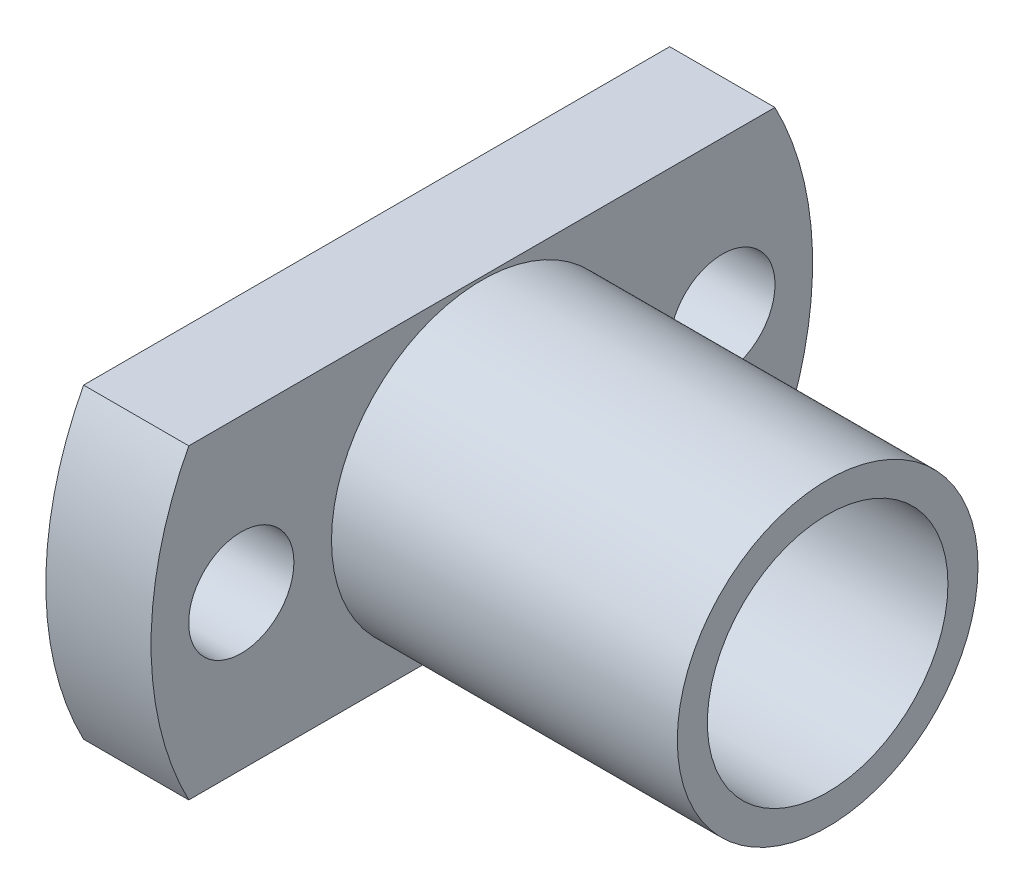
ISO-10303-21;
HEADER;
FILE_DESCRIPTION(('STEP AP214'),'2;1');
FILE_NAME('part.step','',(''),(''),'','','');
FILE_SCHEMA(('AUTOMOTIVE_DESIGN { 1 0 10303 214 1 1 1 1 }'));
ENDSEC;
DATA;
#1=APPLICATION_CONTEXT('core data for automotive mechanical design processes');
#2=APPLICATION_PROTOCOL_DEFINITION('international standard','automotive_design',2000,#1);
#3=PRODUCT_CONTEXT('',#1,'mechanical');
#4=PRODUCT('Part','Part','',(#3));
#5=PRODUCT_RELATED_PRODUCT_CATEGORY('part','',(#4));
#6=PRODUCT_DEFINITION_FORMATION('','',#4);
#7=PRODUCT_DEFINITION_CONTEXT('part definition',#1,'design');
#8=PRODUCT_DEFINITION('design','',#6,#7);
#9=PRODUCT_DEFINITION_SHAPE('','',#8);
#10=(LENGTH_UNIT() NAMED_UNIT(*) SI_UNIT(.MILLI.,.METRE.));
#11=(NAMED_UNIT(*) PLANE_ANGLE_UNIT() SI_UNIT($,.RADIAN.));
#12=(NAMED_UNIT(*) SI_UNIT($,.STERADIAN.) SOLID_ANGLE_UNIT());
#13=UNCERTAINTY_MEASURE_WITH_UNIT(LENGTH_MEASURE(1.E-05),#10,'distance_accuracy_value','');
#14=(GEOMETRIC_REPRESENTATION_CONTEXT(3) GLOBAL_UNCERTAINTY_ASSIGNED_CONTEXT((#13)) GLOBAL_UNIT_ASSIGNED_CONTEXT((#10,
#11,#12)) REPRESENTATION_CONTEXT('',''));
#15=CARTESIAN_POINT('',(0.,0.,0.));
#16=DIRECTION('',(0.,0.,1.));
#17=DIRECTION('',(1.,0.,0.));
#18=AXIS2_PLACEMENT_3D('',#15,#16,#17);
#19=CARTESIAN_POINT('',(5.,0.,0.));
#20=DIRECTION('',(1.,0.,0.));
#21=DIRECTION('',(0.,0.,-1.));
#22=AXIS2_PLACEMENT_3D('',#19,#20,#21);
#23=PLANE('',#22);
#24=CARTESIAN_POINT('',(5.,0.,-8.));
#25=DIRECTION('',(1.,0.,0.));
#26=DIRECTION('',(0.,0.,-1.));
#27=AXIS2_PLACEMENT_3D('',#24,#25,#26);
#28=CIRCLE('',#27,1.75);
#29=CARTESIAN_POINT('',(5.,0.,-9.75));
#30=VERTEX_POINT('',#29);
#31=EDGE_CURVE('E121',#30,#30,#28,.T.);
#32=ORIENTED_EDGE('',*,*,#31,.F.);
#33=EDGE_LOOP('',(#32));
#34=FACE_BOUND('',#33,.T.);
#35=CARTESIAN_POINT('',(5.,0.,0.));
#36=DIRECTION('',(1.,0.,0.));
#37=DIRECTION('',(0.,0.,-1.));
#38=AXIS2_PLACEMENT_3D('',#35,#36,#37);
#39=CIRCLE('',#38,11.);
#40=CARTESIAN_POINT('',(5.,5.1,9.74628134213249));
#41=VERTEX_POINT('',#40);
#42=CARTESIAN_POINT('',(5.,-5.1,9.74628134213249));
#43=VERTEX_POINT('',#42);
#44=EDGE_CURVE('E89',#41,#43,#39,.T.);
#45=ORIENTED_EDGE('',*,*,#44,.T.);
#46=DIRECTION('',(0.,0.,-1.));
#47=VECTOR('',#46,1.);
#48=CARTESIAN_POINT('',(5.,-5.1,9.74628134213249));
#49=LINE('',#48,#47);
#50=CARTESIAN_POINT('',(5.,-5.1,-9.74628134213249));
#51=VERTEX_POINT('',#50);
#52=EDGE_CURVE('E84',#43,#51,#49,.T.);
#53=ORIENTED_EDGE('',*,*,#52,.T.);
#54=CARTESIAN_POINT('',(5.,0.,0.));
#55=DIRECTION('',(1.,0.,0.));
#56=DIRECTION('',(0.,0.,-1.));
#57=AXIS2_PLACEMENT_3D('',#54,#55,#56);
#58=CIRCLE('',#57,11.);
#59=CARTESIAN_POINT('',(5.,5.1,-9.74628134213249));
#60=VERTEX_POINT('',#59);
#61=EDGE_CURVE('E87',#51,#60,#58,.T.);
#62=ORIENTED_EDGE('',*,*,#61,.T.);
#63=DIRECTION('',(0.,0.,1.));
#64=VECTOR('',#63,1.);
#65=CARTESIAN_POINT('',(5.,5.1,9.74628134213249));
#66=LINE('',#65,#64);
#67=EDGE_CURVE('E54',#60,#41,#66,.T.);
#68=ORIENTED_EDGE('',*,*,#67,.T.);
#69=EDGE_LOOP('',(#45,#53,#62,#68));
#70=FACE_BOUND('',#69,.T.);
#71=CARTESIAN_POINT('',(5.,0.,8.));
#72=DIRECTION('',(1.,0.,0.));
#73=DIRECTION('',(0.,0.,-1.));
#74=AXIS2_PLACEMENT_3D('',#71,#72,#73);
#75=CIRCLE('',#74,1.75);
#76=CARTESIAN_POINT('',(5.,0.,6.25));
#77=VERTEX_POINT('',#76);
#78=EDGE_CURVE('E105',#77,#77,#75,.T.);
#79=ORIENTED_EDGE('',*,*,#78,.F.);
#80=EDGE_LOOP('',(#79));
#81=FACE_BOUND('',#80,.T.);
#82=CARTESIAN_POINT('',(5.,0.,0.));
#83=DIRECTION('',(1.,0.,0.));
#84=DIRECTION('',(0.,0.,-1.));
#85=AXIS2_PLACEMENT_3D('',#82,#83,#84);
#86=CIRCLE('',#85,5.);
#87=CARTESIAN_POINT('',(5.,0.,-5.));
#88=VERTEX_POINT('',#87);
#89=EDGE_CURVE('E130',#88,#88,#86,.T.);
#90=ORIENTED_EDGE('',*,*,#89,.F.);
#91=EDGE_LOOP('',(#90));
#92=FACE_BOUND('',#91,.T.);
#93=ADVANCED_FACE('F36',(#34,#70,#81,#92),#23,.T.);
#94=CARTESIAN_POINT('',(1.5,0.,0.));
#95=DIRECTION('',(-1.,0.,0.));
#96=DIRECTION('',(0.,0.,1.));
#97=AXIS2_PLACEMENT_3D('',#94,#95,#96);
#98=CYLINDRICAL_SURFACE('',#97,4.);
#99=CARTESIAN_POINT('',(1.5,0.,0.));
#100=DIRECTION('',(1.,0.,0.));
#101=DIRECTION('',(0.,0.,-1.));
#102=AXIS2_PLACEMENT_3D('',#99,#100,#101);
#103=CIRCLE('',#102,4.);
#104=CARTESIAN_POINT('',(1.5,0.,-4.));
#105=VERTEX_POINT('',#104);
#106=EDGE_CURVE('E40',#105,#105,#103,.T.);
#107=ORIENTED_EDGE('',*,*,#106,.F.);
#108=EDGE_LOOP('',(#107));
#109=FACE_BOUND('',#108,.T.);
#110=CARTESIAN_POINT('',(16.5,0.,0.));
#111=DIRECTION('',(1.,0.,0.));
#112=DIRECTION('',(0.,0.,-1.));
#113=AXIS2_PLACEMENT_3D('',#110,#111,#112);
#114=CIRCLE('',#113,4.);
#115=CARTESIAN_POINT('',(16.5,0.,-4.));
#116=VERTEX_POINT('',#115);
#117=EDGE_CURVE('E133',#116,#116,#114,.T.);
#118=ORIENTED_EDGE('',*,*,#117,.T.);
#119=EDGE_LOOP('',(#118));
#120=FACE_BOUND('',#119,.T.);
#121=ADVANCED_FACE('F38',(#109,#120),#98,.F.);
#122=CARTESIAN_POINT('',(1.5,0.,0.));
#123=DIRECTION('',(1.,0.,0.));
#124=DIRECTION('',(0.,0.,-1.));
#125=AXIS2_PLACEMENT_3D('',#122,#123,#124);
#126=PLANE('',#125);
#127=CARTESIAN_POINT('',(1.5,0.,0.));
#128=DIRECTION('',(1.,0.,0.));
#129=DIRECTION('',(0.,0.,-1.));
#130=AXIS2_PLACEMENT_3D('',#127,#128,#129);
#131=CIRCLE('',#130,11.);
#132=CARTESIAN_POINT('',(1.5,5.1,9.74628134213249));
#133=VERTEX_POINT('',#132);
#134=CARTESIAN_POINT('',(1.5,-5.1,9.74628134213249));
#135=VERTEX_POINT('',#134);
#136=EDGE_CURVE('E102',#133,#135,#131,.T.);
#137=ORIENTED_EDGE('',*,*,#136,.F.);
#138=DIRECTION('',(0.,0.,1.));
#139=VECTOR('',#138,1.);
#140=CARTESIAN_POINT('',(1.5,5.1,9.74628134213249));
#141=LINE('',#140,#139);
#142=CARTESIAN_POINT('',(1.5,5.1,-9.74628134213249));
#143=VERTEX_POINT('',#142);
#144=EDGE_CURVE('E77',#143,#133,#141,.T.);
#145=ORIENTED_EDGE('',*,*,#144,.F.);
#146=CARTESIAN_POINT('',(1.5,0.,0.));
#147=DIRECTION('',(1.,0.,0.));
#148=DIRECTION('',(0.,0.,-1.));
#149=AXIS2_PLACEMENT_3D('',#146,#147,#148);
#150=CIRCLE('',#149,11.);
#151=CARTESIAN_POINT('',(1.5,-5.1,-9.74628134213249));
#152=VERTEX_POINT('',#151);
#153=EDGE_CURVE('E71',#152,#143,#150,.T.);
#154=ORIENTED_EDGE('',*,*,#153,.F.);
#155=DIRECTION('',(0.,0.,-1.));
#156=VECTOR('',#155,1.);
#157=CARTESIAN_POINT('',(1.5,-5.1,9.74628134213249));
#158=LINE('',#157,#156);
#159=EDGE_CURVE('E93',#135,#152,#158,.T.);
#160=ORIENTED_EDGE('',*,*,#159,.F.);
#161=EDGE_LOOP('',(#137,#145,#154,#160));
#162=FACE_BOUND('',#161,.T.);
#163=CARTESIAN_POINT('',(1.5,0.,8.));
#164=DIRECTION('',(1.,0.,0.));
#165=DIRECTION('',(0.,0.,-1.));
#166=AXIS2_PLACEMENT_3D('',#163,#164,#165);
#167=CIRCLE('',#166,1.75);
#168=CARTESIAN_POINT('',(1.5,0.,6.25));
#169=VERTEX_POINT('',#168);
#170=EDGE_CURVE('E118',#169,#169,#167,.T.);
#171=ORIENTED_EDGE('',*,*,#170,.T.);
#172=EDGE_LOOP('',(#171));
#173=FACE_BOUND('',#172,.T.);
#174=CARTESIAN_POINT('',(1.5,0.,-8.));
#175=DIRECTION('',(1.,0.,0.));
#176=DIRECTION('',(0.,0.,-1.));
#177=AXIS2_PLACEMENT_3D('',#174,#175,#176);
#178=CIRCLE('',#177,1.75);
#179=CARTESIAN_POINT('',(1.5,0.,-9.75));
#180=VERTEX_POINT('',#179);
#181=EDGE_CURVE('E124',#180,#180,#178,.T.);
#182=ORIENTED_EDGE('',*,*,#181,.T.);
#183=EDGE_LOOP('',(#182));
#184=FACE_BOUND('',#183,.T.);
#185=ORIENTED_EDGE('',*,*,#106,.T.);
#186=EDGE_LOOP('',(#185));
#187=FACE_BOUND('',#186,.T.);
#188=ADVANCED_FACE('F113',(#162,#173,#184,#187),#126,.F.);
#189=CARTESIAN_POINT('',(5.,0.,0.));
#190=DIRECTION('',(-1.,0.,0.));
#191=DIRECTION('',(0.,0.,1.));
#192=AXIS2_PLACEMENT_3D('',#189,#190,#191);
#193=CYLINDRICAL_SURFACE('',#192,11.);
#194=ORIENTED_EDGE('',*,*,#136,.T.);
#195=DIRECTION('',(-1.,0.,0.));
#196=VECTOR('',#195,1.);
#197=CARTESIAN_POINT('',(5.,-5.1,9.74628134213249));
#198=LINE('',#197,#196);
#199=EDGE_CURVE('E11',#43,#135,#198,.T.);
#200=ORIENTED_EDGE('',*,*,#199,.F.);
#201=ORIENTED_EDGE('',*,*,#44,.F.);
#202=DIRECTION('',(-1.,0.,0.));
#203=VECTOR('',#202,1.);
#204=CARTESIAN_POINT('',(5.,5.1,9.74628134213249));
#205=LINE('',#204,#203);
#206=EDGE_CURVE('E98',#41,#133,#205,.T.);
#207=ORIENTED_EDGE('',*,*,#206,.T.);
#208=EDGE_LOOP('',(#194,#200,#201,#207));
#209=FACE_BOUND('',#208,.T.);
#210=ADVANCED_FACE('F116',(#209),#193,.T.);
#211=CARTESIAN_POINT('',(5.,-5.1,9.74628134213249));
#212=DIRECTION('',(0.,1.,0.));
#213=DIRECTION('',(0.,0.,1.));
#214=AXIS2_PLACEMENT_3D('',#211,#212,#213);
#215=PLANE('',#214);
#216=ORIENTED_EDGE('',*,*,#159,.T.);
#217=DIRECTION('',(-1.,0.,0.));
#218=VECTOR('',#217,1.);
#219=CARTESIAN_POINT('',(5.,-5.1,-9.74628134213249));
#220=LINE('',#219,#218);
#221=EDGE_CURVE('E46',#51,#152,#220,.T.);
#222=ORIENTED_EDGE('',*,*,#221,.F.);
#223=ORIENTED_EDGE('',*,*,#52,.F.);
#224=ORIENTED_EDGE('',*,*,#199,.T.);
#225=EDGE_LOOP('',(#216,#222,#223,#224));
#226=FACE_BOUND('',#225,.T.);
#227=ADVANCED_FACE('F92',(#226),#215,.F.);
#228=CARTESIAN_POINT('',(5.,0.,0.));
#229=DIRECTION('',(-1.,0.,0.));
#230=DIRECTION('',(0.,0.,1.));
#231=AXIS2_PLACEMENT_3D('',#228,#229,#230);
#232=CYLINDRICAL_SURFACE('',#231,11.);
#233=ORIENTED_EDGE('',*,*,#153,.T.);
#234=DIRECTION('',(-1.,0.,0.));
#235=VECTOR('',#234,1.);
#236=CARTESIAN_POINT('',(5.,5.1,-9.74628134213249));
#237=LINE('',#236,#235);
#238=EDGE_CURVE('E94',#60,#143,#237,.T.);
#239=ORIENTED_EDGE('',*,*,#238,.F.);
#240=ORIENTED_EDGE('',*,*,#61,.F.);
#241=ORIENTED_EDGE('',*,*,#221,.T.);
#242=EDGE_LOOP('',(#233,#239,#240,#241));
#243=FACE_BOUND('',#242,.T.);
#244=ADVANCED_FACE('F96',(#243),#232,.T.);
#245=CARTESIAN_POINT('',(5.,5.1,9.74628134213249));
#246=DIRECTION('',(0.,-1.,0.));
#247=DIRECTION('',(0.,0.,-1.));
#248=AXIS2_PLACEMENT_3D('',#245,#246,#247);
#249=PLANE('',#248);
#250=ORIENTED_EDGE('',*,*,#144,.T.);
#251=ORIENTED_EDGE('',*,*,#206,.F.);
#252=ORIENTED_EDGE('',*,*,#67,.F.);
#253=ORIENTED_EDGE('',*,*,#238,.T.);
#254=EDGE_LOOP('',(#250,#251,#252,#253));
#255=FACE_BOUND('',#254,.T.);
#256=ADVANCED_FACE('F110',(#255),#249,.F.);
#257=CARTESIAN_POINT('',(5.,0.,8.));
#258=DIRECTION('',(-1.,0.,0.));
#259=DIRECTION('',(0.,0.,1.));
#260=AXIS2_PLACEMENT_3D('',#257,#258,#259);
#261=CYLINDRICAL_SURFACE('',#260,1.75);
#262=ORIENTED_EDGE('',*,*,#78,.T.);
#263=EDGE_LOOP('',(#262));
#264=FACE_BOUND('',#263,.T.);
#265=ORIENTED_EDGE('',*,*,#170,.F.);
#266=EDGE_LOOP('',(#265));
#267=FACE_BOUND('',#266,.T.);
#268=ADVANCED_FACE('F155',(#264,#267),#261,.F.);
#269=CARTESIAN_POINT('',(5.,0.,-8.));
#270=DIRECTION('',(-1.,0.,0.));
#271=DIRECTION('',(0.,0.,1.));
#272=AXIS2_PLACEMENT_3D('',#269,#270,#271);
#273=CYLINDRICAL_SURFACE('',#272,1.75);
#274=ORIENTED_EDGE('',*,*,#31,.T.);
#275=EDGE_LOOP('',(#274));
#276=FACE_BOUND('',#275,.T.);
#277=ORIENTED_EDGE('',*,*,#181,.F.);
#278=EDGE_LOOP('',(#277));
#279=FACE_BOUND('',#278,.T.);
#280=ADVANCED_FACE('F186',(#276,#279),#273,.F.);
#281=CARTESIAN_POINT('',(16.5,0.,0.));
#282=DIRECTION('',(1.,0.,0.));
#283=DIRECTION('',(0.,0.,-1.));
#284=AXIS2_PLACEMENT_3D('',#281,#282,#283);
#285=PLANE('',#284);
#286=CARTESIAN_POINT('',(16.5,0.,0.));
#287=DIRECTION('',(1.,0.,0.));
#288=DIRECTION('',(0.,0.,-1.));
#289=AXIS2_PLACEMENT_3D('',#286,#287,#288);
#290=CIRCLE('',#289,5.);
#291=CARTESIAN_POINT('',(16.5,0.,-5.));
#292=VERTEX_POINT('',#291);
#293=EDGE_CURVE('E127',#292,#292,#290,.T.);
#294=ORIENTED_EDGE('',*,*,#293,.T.);
#295=EDGE_LOOP('',(#294));
#296=FACE_BOUND('',#295,.T.);
#297=ORIENTED_EDGE('',*,*,#117,.F.);
#298=EDGE_LOOP('',(#297));
#299=FACE_BOUND('',#298,.T.);
#300=ADVANCED_FACE('F193',(#296,#299),#285,.T.);
#301=CARTESIAN_POINT('',(16.5,0.,0.));
#302=DIRECTION('',(-1.,0.,0.));
#303=DIRECTION('',(0.,0.,1.));
#304=AXIS2_PLACEMENT_3D('',#301,#302,#303);
#305=CYLINDRICAL_SURFACE('',#304,5.);
#306=ORIENTED_EDGE('',*,*,#293,.F.);
#307=EDGE_LOOP('',(#306));
#308=FACE_BOUND('',#307,.T.);
#309=ORIENTED_EDGE('',*,*,#89,.T.);
#310=EDGE_LOOP('',(#309));
#311=FACE_BOUND('',#310,.T.);
#312=ADVANCED_FACE('F200',(#308,#311),#305,.T.);
#313=CLOSED_SHELL('',(#93,#121,#188,#210,#227,#244,#256,#268,#280,#300,#312));
#314=MANIFOLD_SOLID_BREP('B2',#313);
#315=ADVANCED_BREP_SHAPE_REPRESENTATION('',(#18,#314),#14);
#316=SHAPE_DEFINITION_REPRESENTATION(#9,#315);
ENDSEC;
END-ISO-10303-21;
